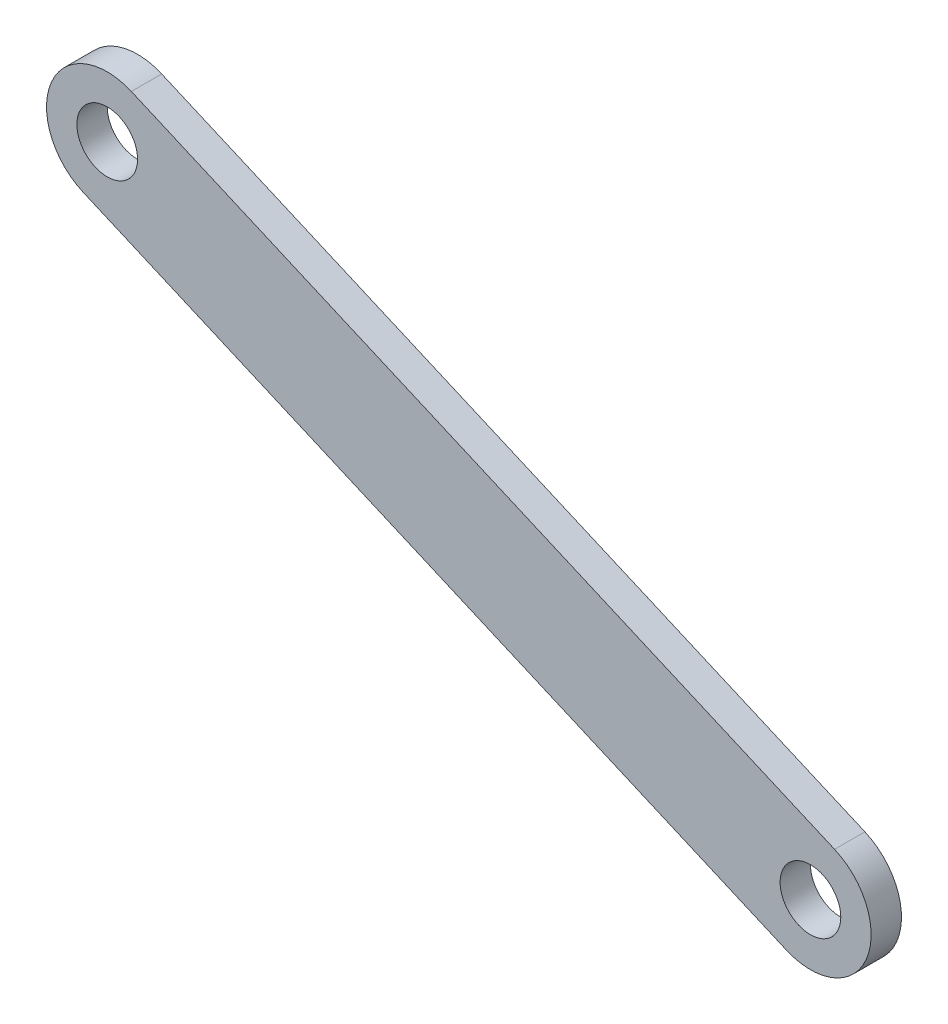
ISO-10303-21;
HEADER;
FILE_DESCRIPTION(('STEP AP214'),'2;1');
FILE_NAME('part.step','',(''),(''),'','','');
FILE_SCHEMA(('AUTOMOTIVE_DESIGN { 1 0 10303 214 1 1 1 1 }'));
ENDSEC;
DATA;
#1=APPLICATION_CONTEXT('core data for automotive mechanical design processes');
#2=APPLICATION_PROTOCOL_DEFINITION('international standard','automotive_design',2000,#1);
#3=PRODUCT_CONTEXT('',#1,'mechanical');
#4=PRODUCT('Part','Part','',(#3));
#5=PRODUCT_RELATED_PRODUCT_CATEGORY('part','',(#4));
#6=PRODUCT_DEFINITION_FORMATION('','',#4);
#7=PRODUCT_DEFINITION_CONTEXT('part definition',#1,'design');
#8=PRODUCT_DEFINITION('design','',#6,#7);
#9=PRODUCT_DEFINITION_SHAPE('','',#8);
#10=(LENGTH_UNIT() NAMED_UNIT(*) SI_UNIT(.MILLI.,.METRE.));
#11=(NAMED_UNIT(*) PLANE_ANGLE_UNIT() SI_UNIT($,.RADIAN.));
#12=(NAMED_UNIT(*) SI_UNIT($,.STERADIAN.) SOLID_ANGLE_UNIT());
#13=UNCERTAINTY_MEASURE_WITH_UNIT(LENGTH_MEASURE(1.E-05),#10,'distance_accuracy_value','');
#14=(GEOMETRIC_REPRESENTATION_CONTEXT(3) GLOBAL_UNCERTAINTY_ASSIGNED_CONTEXT((#13)) GLOBAL_UNIT_ASSIGNED_CONTEXT((#10,
#11,#12)) REPRESENTATION_CONTEXT('',''));
#15=CARTESIAN_POINT('',(0.,0.,0.));
#16=DIRECTION('',(0.,0.,1.));
#17=DIRECTION('',(1.,0.,0.));
#18=AXIS2_PLACEMENT_3D('',#15,#16,#17);
#19=CARTESIAN_POINT('',(-74.7943653809361,8.1431702058961,-1.5875));
#20=DIRECTION('',(0.,0.,1.));
#21=DIRECTION('',(1.,0.,0.));
#22=AXIS2_PLACEMENT_3D('',#19,#20,#21);
#23=CYLINDRICAL_SURFACE('',#22,3.17499999999999);
#24=CARTESIAN_POINT('',(-74.7943653809361,8.1431702058961,0.));
#25=DIRECTION('',(0.,0.,1.));
#26=DIRECTION('',(1.,0.,0.));
#27=AXIS2_PLACEMENT_3D('',#24,#25,#26);
#28=CIRCLE('',#27,3.17499999999999);
#29=CARTESIAN_POINT('',(-73.5320320790977,11.0564397840625,0.));
#30=VERTEX_POINT('',#29);
#31=CARTESIAN_POINT('',(-76.0566986827745,5.22990062772972,0.));
#32=VERTEX_POINT('',#31);
#33=EDGE_CURVE('E99',#30,#32,#28,.T.);
#34=ORIENTED_EDGE('',*,*,#33,.F.);
#35=DIRECTION('',(0.,0.,1.));
#36=VECTOR('',#35,1.);
#37=CARTESIAN_POINT('',(-73.5320320790977,11.0564397840625,-1.5875));
#38=LINE('',#37,#36);
#39=CARTESIAN_POINT('',(-73.5320320790977,11.0564397840625,-1.5875));
#40=VERTEX_POINT('',#39);
#41=EDGE_CURVE('E11',#40,#30,#38,.T.);
#42=ORIENTED_EDGE('',*,*,#41,.F.);
#43=CARTESIAN_POINT('',(-74.7943653809361,8.1431702058961,-1.5875));
#44=DIRECTION('',(0.,0.,1.));
#45=DIRECTION('',(1.,0.,0.));
#46=AXIS2_PLACEMENT_3D('',#43,#44,#45);
#47=CIRCLE('',#46,3.17499999999999);
#48=CARTESIAN_POINT('',(-76.0566986827745,5.22990062772972,-1.5875));
#49=VERTEX_POINT('',#48);
#50=EDGE_CURVE('E92',#40,#49,#47,.T.);
#51=ORIENTED_EDGE('',*,*,#50,.T.);
#52=DIRECTION('',(0.,0.,1.));
#53=VECTOR('',#52,1.);
#54=CARTESIAN_POINT('',(-76.0566986827745,5.22990062772972,-1.5875));
#55=LINE('',#54,#53);
#56=EDGE_CURVE('E37',#49,#32,#55,.T.);
#57=ORIENTED_EDGE('',*,*,#56,.T.);
#58=EDGE_LOOP('',(#34,#42,#51,#57));
#59=FACE_BOUND('',#58,.T.);
#60=ADVANCED_FACE('F34',(#59),#23,.T.);
#61=CARTESIAN_POINT('',(-73.5320320790977,11.0564397840625,-1.5875));
#62=DIRECTION('',(0.397585291917608,0.917565221469727,0.));
#63=DIRECTION('',(-0.917565221469728,0.397585291917609,0.));
#64=AXIS2_PLACEMENT_3D('',#61,#62,#63);
#65=PLANE('',#64);
#66=DIRECTION('',(-0.917565221469728,0.397585291917608,0.));
#67=VECTOR('',#66,1.);
#68=CARTESIAN_POINT('',(-73.5320320790977,11.0564397840625,0.));
#69=LINE('',#68,#67);
#70=CARTESIAN_POINT('',(-36.7376666981616,-4.88673042183362,0.));
#71=VERTEX_POINT('',#70);
#72=EDGE_CURVE('E94',#71,#30,#69,.T.);
#73=ORIENTED_EDGE('',*,*,#72,.F.);
#74=DIRECTION('',(0.,0.,1.));
#75=VECTOR('',#74,1.);
#76=CARTESIAN_POINT('',(-36.7376666981616,-4.88673042183362,-1.5875));
#77=LINE('',#76,#75);
#78=CARTESIAN_POINT('',(-36.7376666981616,-4.88673042183362,-1.5875));
#79=VERTEX_POINT('',#78);
#80=EDGE_CURVE('E43',#79,#71,#77,.T.);
#81=ORIENTED_EDGE('',*,*,#80,.F.);
#82=DIRECTION('',(-0.917565221469728,0.397585291917608,0.));
#83=VECTOR('',#82,1.);
#84=CARTESIAN_POINT('',(-73.5320320790977,11.0564397840625,-1.5875));
#85=LINE('',#84,#83);
#86=EDGE_CURVE('E89',#79,#40,#85,.T.);
#87=ORIENTED_EDGE('',*,*,#86,.T.);
#88=ORIENTED_EDGE('',*,*,#41,.T.);
#89=EDGE_LOOP('',(#73,#81,#87,#88));
#90=FACE_BOUND('',#89,.T.);
#91=ADVANCED_FACE('F110',(#90),#65,.T.);
#92=CARTESIAN_POINT('',(-38.,-7.80000000000001,-1.5875));
#93=DIRECTION('',(0.,0.,1.));
#94=DIRECTION('',(1.,0.,0.));
#95=AXIS2_PLACEMENT_3D('',#92,#93,#94);
#96=CYLINDRICAL_SURFACE('',#95,3.175);
#97=CARTESIAN_POINT('',(-38.,-7.80000000000001,0.));
#98=DIRECTION('',(0.,0.,1.));
#99=DIRECTION('',(1.,0.,0.));
#100=AXIS2_PLACEMENT_3D('',#97,#98,#99);
#101=CIRCLE('',#100,3.175);
#102=CARTESIAN_POINT('',(-39.2623333018384,-10.7132695781664,0.));
#103=VERTEX_POINT('',#102);
#104=EDGE_CURVE('E84',#103,#71,#101,.T.);
#105=ORIENTED_EDGE('',*,*,#104,.F.);
#106=DIRECTION('',(0.,0.,1.));
#107=VECTOR('',#106,1.);
#108=CARTESIAN_POINT('',(-39.2623333018384,-10.7132695781664,-1.5875));
#109=LINE('',#108,#107);
#110=CARTESIAN_POINT('',(-39.2623333018384,-10.7132695781664,-1.5875));
#111=VERTEX_POINT('',#110);
#112=EDGE_CURVE('E79',#111,#103,#109,.T.);
#113=ORIENTED_EDGE('',*,*,#112,.F.);
#114=CARTESIAN_POINT('',(-38.,-7.80000000000001,-1.5875));
#115=DIRECTION('',(0.,0.,1.));
#116=DIRECTION('',(1.,0.,0.));
#117=AXIS2_PLACEMENT_3D('',#114,#115,#116);
#118=CIRCLE('',#117,3.175);
#119=EDGE_CURVE('E82',#111,#79,#118,.T.);
#120=ORIENTED_EDGE('',*,*,#119,.T.);
#121=ORIENTED_EDGE('',*,*,#80,.T.);
#122=EDGE_LOOP('',(#105,#113,#120,#121));
#123=FACE_BOUND('',#122,.T.);
#124=ADVANCED_FACE('F81',(#123),#96,.T.);
#125=CARTESIAN_POINT('',(-76.0566986827745,5.22990062772972,-1.5875));
#126=DIRECTION('',(-0.397585291917609,-0.917565221469727,0.));
#127=DIRECTION('',(0.917565221469728,-0.397585291917609,0.));
#128=AXIS2_PLACEMENT_3D('',#125,#126,#127);
#129=PLANE('',#128);
#130=DIRECTION('',(0.917565221469728,-0.397585291917609,0.));
#131=VECTOR('',#130,1.);
#132=CARTESIAN_POINT('',(-76.0566986827745,5.22990062772972,0.));
#133=LINE('',#132,#131);
#134=EDGE_CURVE('E102',#32,#103,#133,.T.);
#135=ORIENTED_EDGE('',*,*,#134,.F.);
#136=ORIENTED_EDGE('',*,*,#56,.F.);
#137=DIRECTION('',(0.917565221469728,-0.397585291917609,0.));
#138=VECTOR('',#137,1.);
#139=CARTESIAN_POINT('',(-76.0566986827745,5.22990062772972,-1.5875));
#140=LINE('',#139,#138);
#141=EDGE_CURVE('E88',#49,#111,#140,.T.);
#142=ORIENTED_EDGE('',*,*,#141,.T.);
#143=ORIENTED_EDGE('',*,*,#112,.T.);
#144=EDGE_LOOP('',(#135,#136,#142,#143));
#145=FACE_BOUND('',#144,.T.);
#146=ADVANCED_FACE('F91',(#145),#129,.T.);
#147=CARTESIAN_POINT('',(-74.7943653809361,8.1431702058961,-1.5875));
#148=DIRECTION('',(0.,0.,1.));
#149=DIRECTION('',(1.,0.,0.));
#150=AXIS2_PLACEMENT_3D('',#147,#148,#149);
#151=PLANE('',#150);
#152=CARTESIAN_POINT('',(-74.7943653809361,8.1431702058961,-1.5875));
#153=DIRECTION('',(0.,0.,1.));
#154=DIRECTION('',(1.,0.,0.));
#155=AXIS2_PLACEMENT_3D('',#152,#153,#154);
#156=CIRCLE('',#155,1.5875);
#157=CARTESIAN_POINT('',(-73.2068653809361,8.1431702058961,-1.5875));
#158=VERTEX_POINT('',#157);
#159=EDGE_CURVE('E143',#158,#158,#156,.T.);
#160=ORIENTED_EDGE('',*,*,#159,.T.);
#161=EDGE_LOOP('',(#160));
#162=FACE_BOUND('',#161,.T.);
#163=CARTESIAN_POINT('',(-38.,-7.80000000000001,-1.5875));
#164=DIRECTION('',(0.,0.,1.));
#165=DIRECTION('',(1.,0.,0.));
#166=AXIS2_PLACEMENT_3D('',#163,#164,#165);
#167=CIRCLE('',#166,1.5875);
#168=CARTESIAN_POINT('',(-36.4125,-7.80000000000001,-1.5875));
#169=VERTEX_POINT('',#168);
#170=EDGE_CURVE('E103',#169,#169,#167,.T.);
#171=ORIENTED_EDGE('',*,*,#170,.T.);
#172=EDGE_LOOP('',(#171));
#173=FACE_BOUND('',#172,.T.);
#174=ORIENTED_EDGE('',*,*,#50,.F.);
#175=ORIENTED_EDGE('',*,*,#86,.F.);
#176=ORIENTED_EDGE('',*,*,#119,.F.);
#177=ORIENTED_EDGE('',*,*,#141,.F.);
#178=EDGE_LOOP('',(#174,#175,#176,#177));
#179=FACE_BOUND('',#178,.T.);
#180=ADVANCED_FACE('F87',(#162,#173,#179),#151,.F.);
#181=CARTESIAN_POINT('',(-74.7943653809361,8.1431702058961,0.));
#182=DIRECTION('',(0.,0.,1.));
#183=DIRECTION('',(1.,0.,0.));
#184=AXIS2_PLACEMENT_3D('',#181,#182,#183);
#185=PLANE('',#184);
#186=CARTESIAN_POINT('',(-74.7943653809361,8.1431702058961,0.));
#187=DIRECTION('',(0.,0.,1.));
#188=DIRECTION('',(1.,0.,0.));
#189=AXIS2_PLACEMENT_3D('',#186,#187,#188);
#190=CIRCLE('',#189,1.5875);
#191=CARTESIAN_POINT('',(-73.2068653809361,8.1431702058961,0.));
#192=VERTEX_POINT('',#191);
#193=EDGE_CURVE('E146',#192,#192,#190,.T.);
#194=ORIENTED_EDGE('',*,*,#193,.F.);
#195=EDGE_LOOP('',(#194));
#196=FACE_BOUND('',#195,.T.);
#197=CARTESIAN_POINT('',(-38.,-7.80000000000001,0.));
#198=DIRECTION('',(0.,0.,1.));
#199=DIRECTION('',(1.,0.,0.));
#200=AXIS2_PLACEMENT_3D('',#197,#198,#199);
#201=CIRCLE('',#200,1.5875);
#202=CARTESIAN_POINT('',(-36.4125,-7.80000000000001,0.));
#203=VERTEX_POINT('',#202);
#204=EDGE_CURVE('E148',#203,#203,#201,.T.);
#205=ORIENTED_EDGE('',*,*,#204,.F.);
#206=EDGE_LOOP('',(#205));
#207=FACE_BOUND('',#206,.T.);
#208=ORIENTED_EDGE('',*,*,#33,.T.);
#209=ORIENTED_EDGE('',*,*,#134,.T.);
#210=ORIENTED_EDGE('',*,*,#104,.T.);
#211=ORIENTED_EDGE('',*,*,#72,.T.);
#212=EDGE_LOOP('',(#208,#209,#210,#211));
#213=FACE_BOUND('',#212,.T.);
#214=ADVANCED_FACE('F109',(#196,#207,#213),#185,.T.);
#215=CARTESIAN_POINT('',(-38.,-7.80000000000001,-1.5875));
#216=DIRECTION('',(0.,0.,1.));
#217=DIRECTION('',(1.,0.,0.));
#218=AXIS2_PLACEMENT_3D('',#215,#216,#217);
#219=CYLINDRICAL_SURFACE('',#218,1.5875);
#220=ORIENTED_EDGE('',*,*,#170,.F.);
#221=EDGE_LOOP('',(#220));
#222=FACE_BOUND('',#221,.T.);
#223=ORIENTED_EDGE('',*,*,#204,.T.);
#224=EDGE_LOOP('',(#223));
#225=FACE_BOUND('',#224,.T.);
#226=ADVANCED_FACE('F128',(#222,#225),#219,.F.);
#227=CARTESIAN_POINT('',(-74.7943653809361,8.1431702058961,-1.5875));
#228=DIRECTION('',(0.,0.,1.));
#229=DIRECTION('',(1.,0.,0.));
#230=AXIS2_PLACEMENT_3D('',#227,#228,#229);
#231=CYLINDRICAL_SURFACE('',#230,1.5875);
#232=ORIENTED_EDGE('',*,*,#159,.F.);
#233=EDGE_LOOP('',(#232));
#234=FACE_BOUND('',#233,.T.);
#235=ORIENTED_EDGE('',*,*,#193,.T.);
#236=EDGE_LOOP('',(#235));
#237=FACE_BOUND('',#236,.T.);
#238=ADVANCED_FACE('F135',(#234,#237),#231,.F.);
#239=CLOSED_SHELL('',(#60,#91,#124,#146,#180,#214,#226,#238));
#240=MANIFOLD_SOLID_BREP('B2',#239);
#241=ADVANCED_BREP_SHAPE_REPRESENTATION('',(#18,#240),#14);
#242=SHAPE_DEFINITION_REPRESENTATION(#9,#241);
ENDSEC;
END-ISO-10303-21;
